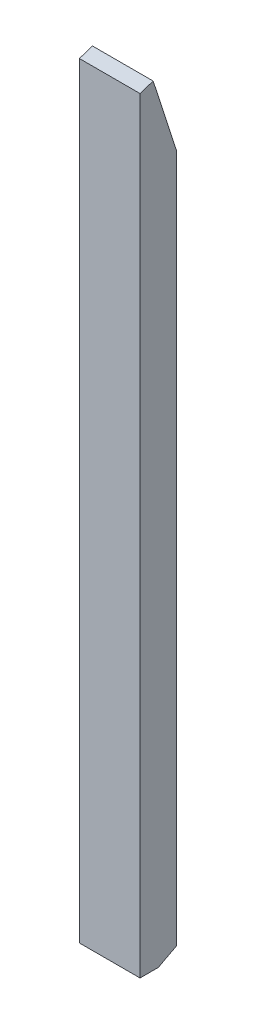
ISO-10303-21;
HEADER;
FILE_DESCRIPTION(('STEP AP214'),'2;1');
FILE_NAME('part.step','',(''),(''),'','','');
FILE_SCHEMA(('AUTOMOTIVE_DESIGN { 1 0 10303 214 1 1 1 1 }'));
ENDSEC;
DATA;
#1=APPLICATION_CONTEXT('core data for automotive mechanical design processes');
#2=APPLICATION_PROTOCOL_DEFINITION('international standard','automotive_design',2000,#1);
#3=PRODUCT_CONTEXT('',#1,'mechanical');
#4=PRODUCT('Part','Part','',(#3));
#5=PRODUCT_RELATED_PRODUCT_CATEGORY('part','',(#4));
#6=PRODUCT_DEFINITION_FORMATION('','',#4);
#7=PRODUCT_DEFINITION_CONTEXT('part definition',#1,'design');
#8=PRODUCT_DEFINITION('design','',#6,#7);
#9=PRODUCT_DEFINITION_SHAPE('','',#8);
#10=(LENGTH_UNIT() NAMED_UNIT(*) SI_UNIT(.MILLI.,.METRE.));
#11=(NAMED_UNIT(*) PLANE_ANGLE_UNIT() SI_UNIT($,.RADIAN.));
#12=(NAMED_UNIT(*) SI_UNIT($,.STERADIAN.) SOLID_ANGLE_UNIT());
#13=UNCERTAINTY_MEASURE_WITH_UNIT(LENGTH_MEASURE(1.E-05),#10,'distance_accuracy_value','');
#14=(GEOMETRIC_REPRESENTATION_CONTEXT(3) GLOBAL_UNCERTAINTY_ASSIGNED_CONTEXT((#13)) GLOBAL_UNIT_ASSIGNED_CONTEXT((#10,
#11,#12)) REPRESENTATION_CONTEXT('',''));
#15=CARTESIAN_POINT('',(0.,0.,0.));
#16=DIRECTION('',(0.,0.,1.));
#17=DIRECTION('',(1.,0.,0.));
#18=AXIS2_PLACEMENT_3D('',#15,#16,#17);
#19=CARTESIAN_POINT('',(0.,0.,38.));
#20=DIRECTION('',(1.,0.,0.));
#21=DIRECTION('',(0.,0.,-1.));
#22=AXIS2_PLACEMENT_3D('',#19,#20,#21);
#23=PLANE('',#22);
#24=DIRECTION('',(0.,-1.,0.));
#25=VECTOR('',#24,1.);
#26=CARTESIAN_POINT('',(0.,0.,38.));
#27=LINE('',#26,#25);
#28=CARTESIAN_POINT('',(0.,795.571012218156,38.));
#29=VERTEX_POINT('',#28);
#30=CARTESIAN_POINT('',(0.,0.,38.));
#31=VERTEX_POINT('',#30);
#32=EDGE_CURVE('E108',#29,#31,#27,.T.);
#33=ORIENTED_EDGE('',*,*,#32,.F.);
#34=DIRECTION('',(0.,-0.30901699437494,0.951056516295156));
#35=VECTOR('',#34,1.);
#36=CARTESIAN_POINT('',(0.,800.,24.3689772174674));
#37=LINE('',#36,#35);
#38=CARTESIAN_POINT('',(0.,800.,24.3689772174674));
#39=VERTEX_POINT('',#38);
#40=EDGE_CURVE('E92',#39,#29,#37,.T.);
#41=ORIENTED_EDGE('',*,*,#40,.F.);
#42=DIRECTION('',(0.,0.951056516295156,0.309016994374941));
#43=VECTOR('',#42,1.);
#44=CARTESIAN_POINT('',(0.,800.,24.3689772174674));
#45=LINE('',#44,#43);
#46=CARTESIAN_POINT('',(0.,725.,0.));
#47=VERTEX_POINT('',#46);
#48=EDGE_CURVE('E120',#47,#39,#45,.T.);
#49=ORIENTED_EDGE('',*,*,#48,.F.);
#50=DIRECTION('',(0.,-1.,0.));
#51=VECTOR('',#50,1.);
#52=CARTESIAN_POINT('',(0.,0.,0.));
#53=LINE('',#52,#51);
#54=CARTESIAN_POINT('',(0.,10.,0.));
#55=VERTEX_POINT('',#54);
#56=EDGE_CURVE('E112',#47,#55,#53,.T.);
#57=ORIENTED_EDGE('',*,*,#56,.T.);
#58=DIRECTION('',(0.,0.465746432832622,-0.884918222381982));
#59=VECTOR('',#58,1.);
#60=CARTESIAN_POINT('',(0.,0.,19.));
#61=LINE('',#60,#59);
#62=CARTESIAN_POINT('',(0.,0.,19.));
#63=VERTEX_POINT('',#62);
#64=EDGE_CURVE('E47',#63,#55,#61,.T.);
#65=ORIENTED_EDGE('',*,*,#64,.F.);
#66=DIRECTION('',(0.,0.,-1.));
#67=VECTOR('',#66,1.);
#68=CARTESIAN_POINT('',(0.,0.,38.));
#69=LINE('',#68,#67);
#70=EDGE_CURVE('E11',#31,#63,#69,.T.);
#71=ORIENTED_EDGE('',*,*,#70,.F.);
#72=EDGE_LOOP('',(#33,#41,#49,#57,#65,#71));
#73=FACE_BOUND('',#72,.T.);
#74=ADVANCED_FACE('F33',(#73),#23,.F.);
#75=CARTESIAN_POINT('',(0.,0.,38.));
#76=DIRECTION('',(0.,1.,0.));
#77=DIRECTION('',(0.,0.,1.));
#78=AXIS2_PLACEMENT_3D('',#75,#76,#77);
#79=PLANE('',#78);
#80=ORIENTED_EDGE('',*,*,#70,.T.);
#81=DIRECTION('',(-1.,0.,0.));
#82=VECTOR('',#81,1.);
#83=CARTESIAN_POINT('',(63.,0.,19.));
#84=LINE('',#83,#82);
#85=CARTESIAN_POINT('',(63.,0.,19.));
#86=VERTEX_POINT('',#85);
#87=EDGE_CURVE('E125',#86,#63,#84,.T.);
#88=ORIENTED_EDGE('',*,*,#87,.F.);
#89=DIRECTION('',(0.,0.,-1.));
#90=VECTOR('',#89,1.);
#91=CARTESIAN_POINT('',(63.,0.,38.));
#92=LINE('',#91,#90);
#93=CARTESIAN_POINT('',(63.,0.,38.));
#94=VERTEX_POINT('',#93);
#95=EDGE_CURVE('E40',#94,#86,#92,.T.);
#96=ORIENTED_EDGE('',*,*,#95,.F.);
#97=DIRECTION('',(1.,0.,0.));
#98=VECTOR('',#97,1.);
#99=CARTESIAN_POINT('',(0.,0.,38.));
#100=LINE('',#99,#98);
#101=EDGE_CURVE('E105',#31,#94,#100,.T.);
#102=ORIENTED_EDGE('',*,*,#101,.F.);
#103=EDGE_LOOP('',(#80,#88,#96,#102));
#104=FACE_BOUND('',#103,.T.);
#105=ADVANCED_FACE('F142',(#104),#79,.F.);
#106=CARTESIAN_POINT('',(63.,0.,38.));
#107=DIRECTION('',(-1.,0.,0.));
#108=DIRECTION('',(0.,0.,1.));
#109=AXIS2_PLACEMENT_3D('',#106,#107,#108);
#110=PLANE('',#109);
#111=DIRECTION('',(0.,0.951056516295156,0.309016994374941));
#112=VECTOR('',#111,1.);
#113=CARTESIAN_POINT('',(63.,800.,24.3689772174674));
#114=LINE('',#113,#112);
#115=CARTESIAN_POINT('',(63.,725.,0.));
#116=VERTEX_POINT('',#115);
#117=CARTESIAN_POINT('',(63.,800.,24.3689772174674));
#118=VERTEX_POINT('',#117);
#119=EDGE_CURVE('E101',#116,#118,#114,.T.);
#120=ORIENTED_EDGE('',*,*,#119,.T.);
#121=DIRECTION('',(0.,-0.30901699437494,0.951056516295156));
#122=VECTOR('',#121,1.);
#123=CARTESIAN_POINT('',(63.,800.,24.3689772174674));
#124=LINE('',#123,#122);
#125=CARTESIAN_POINT('',(63.,795.571012218156,38.));
#126=VERTEX_POINT('',#125);
#127=EDGE_CURVE('E89',#118,#126,#124,.T.);
#128=ORIENTED_EDGE('',*,*,#127,.T.);
#129=DIRECTION('',(0.,1.,0.));
#130=VECTOR('',#129,1.);
#131=CARTESIAN_POINT('',(63.,0.,38.));
#132=LINE('',#131,#130);
#133=EDGE_CURVE('E100',#94,#126,#132,.T.);
#134=ORIENTED_EDGE('',*,*,#133,.F.);
#135=ORIENTED_EDGE('',*,*,#95,.T.);
#136=DIRECTION('',(0.,0.465746432832622,-0.884918222381982));
#137=VECTOR('',#136,1.);
#138=CARTESIAN_POINT('',(63.,0.,19.));
#139=LINE('',#138,#137);
#140=CARTESIAN_POINT('',(63.,10.,0.));
#141=VERTEX_POINT('',#140);
#142=EDGE_CURVE('E127',#86,#141,#139,.T.);
#143=ORIENTED_EDGE('',*,*,#142,.T.);
#144=DIRECTION('',(0.,1.,0.));
#145=VECTOR('',#144,1.);
#146=CARTESIAN_POINT('',(63.,0.,0.));
#147=LINE('',#146,#145);
#148=EDGE_CURVE('E55',#141,#116,#147,.T.);
#149=ORIENTED_EDGE('',*,*,#148,.T.);
#150=EDGE_LOOP('',(#120,#128,#134,#135,#143,#149));
#151=FACE_BOUND('',#150,.T.);
#152=ADVANCED_FACE('F98',(#151),#110,.F.);
#153=CARTESIAN_POINT('',(0.,0.,38.));
#154=DIRECTION('',(0.,0.,-1.));
#155=DIRECTION('',(-1.,0.,0.));
#156=AXIS2_PLACEMENT_3D('',#153,#154,#155);
#157=PLANE('',#156);
#158=ORIENTED_EDGE('',*,*,#133,.T.);
#159=DIRECTION('',(-1.,0.,0.));
#160=VECTOR('',#159,1.);
#161=CARTESIAN_POINT('',(63.,795.571012218156,38.));
#162=LINE('',#161,#160);
#163=EDGE_CURVE('E86',#126,#29,#162,.T.);
#164=ORIENTED_EDGE('',*,*,#163,.T.);
#165=ORIENTED_EDGE('',*,*,#32,.T.);
#166=ORIENTED_EDGE('',*,*,#101,.T.);
#167=EDGE_LOOP('',(#158,#164,#165,#166));
#168=FACE_BOUND('',#167,.T.);
#169=ADVANCED_FACE('F103',(#168),#157,.F.);
#170=CARTESIAN_POINT('',(0.,0.,0.));
#171=DIRECTION('',(0.,0.,-1.));
#172=DIRECTION('',(-1.,0.,0.));
#173=AXIS2_PLACEMENT_3D('',#170,#171,#172);
#174=PLANE('',#173);
#175=DIRECTION('',(-1.,0.,0.));
#176=VECTOR('',#175,1.);
#177=CARTESIAN_POINT('',(63.,10.,0.));
#178=LINE('',#177,#176);
#179=EDGE_CURVE('E123',#141,#55,#178,.T.);
#180=ORIENTED_EDGE('',*,*,#179,.T.);
#181=ORIENTED_EDGE('',*,*,#56,.F.);
#182=DIRECTION('',(-1.,0.,0.));
#183=VECTOR('',#182,1.);
#184=CARTESIAN_POINT('',(63.,725.,0.));
#185=LINE('',#184,#183);
#186=EDGE_CURVE('E117',#116,#47,#185,.T.);
#187=ORIENTED_EDGE('',*,*,#186,.F.);
#188=ORIENTED_EDGE('',*,*,#148,.F.);
#189=EDGE_LOOP('',(#180,#181,#187,#188));
#190=FACE_BOUND('',#189,.T.);
#191=ADVANCED_FACE('F134',(#190),#174,.T.);
#192=CARTESIAN_POINT('',(63.,800.,24.3689772174674));
#193=DIRECTION('',(0.,-0.309016994374941,0.951056516295156));
#194=DIRECTION('',(0.,-0.951056516295156,-0.309016994374941));
#195=AXIS2_PLACEMENT_3D('',#192,#193,#194);
#196=PLANE('',#195);
#197=ORIENTED_EDGE('',*,*,#48,.T.);
#198=DIRECTION('',(-1.,0.,0.));
#199=VECTOR('',#198,1.);
#200=CARTESIAN_POINT('',(63.,800.,24.3689772174674));
#201=LINE('',#200,#199);
#202=EDGE_CURVE('E115',#118,#39,#201,.T.);
#203=ORIENTED_EDGE('',*,*,#202,.F.);
#204=ORIENTED_EDGE('',*,*,#119,.F.);
#205=ORIENTED_EDGE('',*,*,#186,.T.);
#206=EDGE_LOOP('',(#197,#203,#204,#205));
#207=FACE_BOUND('',#206,.T.);
#208=ADVANCED_FACE('F138',(#207),#196,.F.);
#209=CARTESIAN_POINT('',(63.,0.,19.));
#210=DIRECTION('',(0.,0.884918222381982,0.465746432832622));
#211=DIRECTION('',(0.,-0.465746432832622,0.884918222381982));
#212=AXIS2_PLACEMENT_3D('',#209,#210,#211);
#213=PLANE('',#212);
#214=ORIENTED_EDGE('',*,*,#64,.T.);
#215=ORIENTED_EDGE('',*,*,#179,.F.);
#216=ORIENTED_EDGE('',*,*,#142,.F.);
#217=ORIENTED_EDGE('',*,*,#87,.T.);
#218=EDGE_LOOP('',(#214,#215,#216,#217));
#219=FACE_BOUND('',#218,.T.);
#220=ADVANCED_FACE('F143',(#219),#213,.F.);
#221=CARTESIAN_POINT('',(63.,800.,24.3689772174674));
#222=DIRECTION('',(0.,-0.951056516295156,-0.30901699437494));
#223=DIRECTION('',(0.,0.30901699437494,-0.951056516295156));
#224=AXIS2_PLACEMENT_3D('',#221,#222,#223);
#225=PLANE('',#224);
#226=ORIENTED_EDGE('',*,*,#40,.T.);
#227=ORIENTED_EDGE('',*,*,#163,.F.);
#228=ORIENTED_EDGE('',*,*,#127,.F.);
#229=ORIENTED_EDGE('',*,*,#202,.T.);
#230=EDGE_LOOP('',(#226,#227,#228,#229));
#231=FACE_BOUND('',#230,.T.);
#232=ADVANCED_FACE('F88',(#231),#225,.F.);
#233=CLOSED_SHELL('',(#74,#105,#152,#169,#191,#208,#220,#232));
#234=MANIFOLD_SOLID_BREP('B2',#233);
#235=ADVANCED_BREP_SHAPE_REPRESENTATION('',(#18,#234),#14);
#236=SHAPE_DEFINITION_REPRESENTATION(#9,#235);
ENDSEC;
END-ISO-10303-21;
